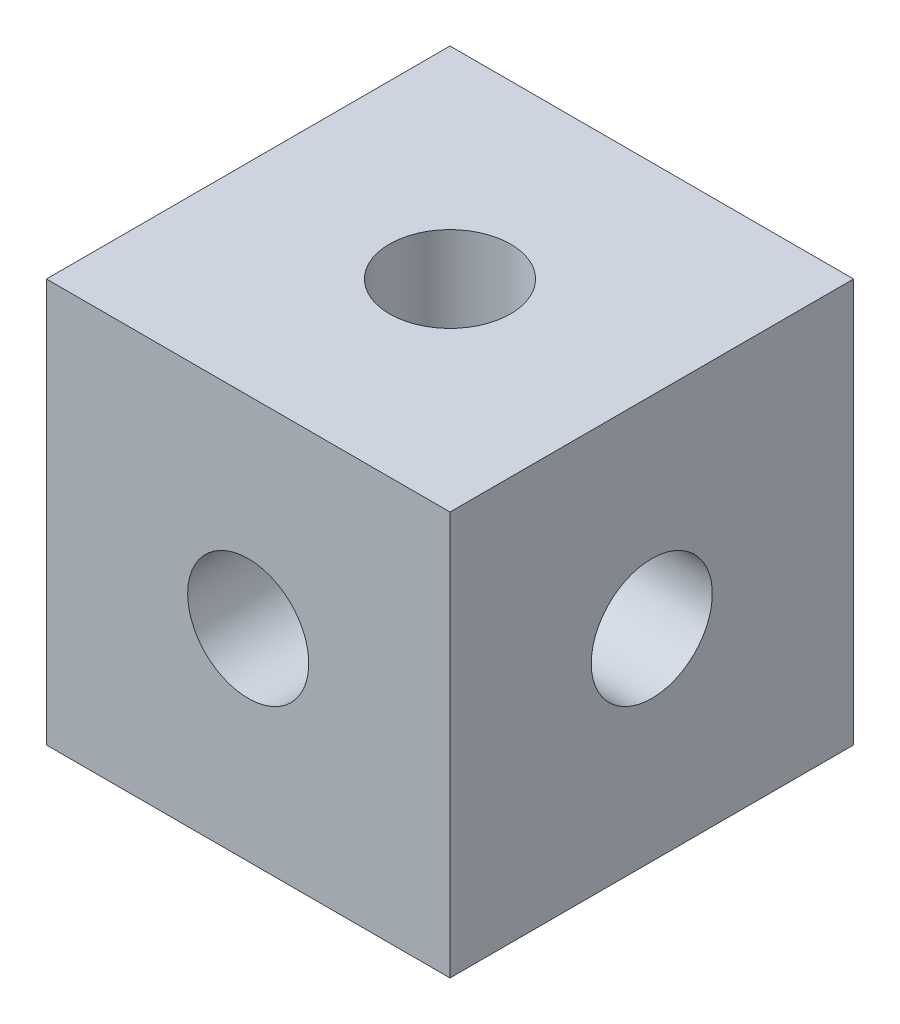
ISO-10303-21;
HEADER;
FILE_DESCRIPTION(('STEP AP214'),'2;1');
FILE_NAME('part.step','',(''),(''),'','','');
FILE_SCHEMA(('AUTOMOTIVE_DESIGN { 1 0 10303 214 1 1 1 1 }'));
ENDSEC;
DATA;
#1=APPLICATION_CONTEXT('core data for automotive mechanical design processes');
#2=APPLICATION_PROTOCOL_DEFINITION('international standard','automotive_design',2000,#1);
#3=PRODUCT_CONTEXT('',#1,'mechanical');
#4=PRODUCT('Part','Part','',(#3));
#5=PRODUCT_RELATED_PRODUCT_CATEGORY('part','',(#4));
#6=PRODUCT_DEFINITION_FORMATION('','',#4);
#7=PRODUCT_DEFINITION_CONTEXT('part definition',#1,'design');
#8=PRODUCT_DEFINITION('design','',#6,#7);
#9=PRODUCT_DEFINITION_SHAPE('','',#8);
#10=(LENGTH_UNIT() NAMED_UNIT(*) SI_UNIT(.MILLI.,.METRE.));
#11=(NAMED_UNIT(*) PLANE_ANGLE_UNIT() SI_UNIT($,.RADIAN.));
#12=(NAMED_UNIT(*) SI_UNIT($,.STERADIAN.) SOLID_ANGLE_UNIT());
#13=UNCERTAINTY_MEASURE_WITH_UNIT(LENGTH_MEASURE(1.E-05),#10,'distance_accuracy_value','');
#14=(GEOMETRIC_REPRESENTATION_CONTEXT(3) GLOBAL_UNCERTAINTY_ASSIGNED_CONTEXT((#13)) GLOBAL_UNIT_ASSIGNED_CONTEXT((#10,
#11,#12)) REPRESENTATION_CONTEXT('',''));
#15=CARTESIAN_POINT('',(0.,0.,0.));
#16=DIRECTION('',(0.,0.,1.));
#17=DIRECTION('',(1.,0.,0.));
#18=AXIS2_PLACEMENT_3D('',#15,#16,#17);
#19=CARTESIAN_POINT('',(5.,10.,-5.));
#20=DIRECTION('',(0.,-1.,0.));
#21=DIRECTION('',(0.,0.,-1.));
#22=AXIS2_PLACEMENT_3D('',#19,#20,#21);
#23=CYLINDRICAL_SURFACE('',#22,1.5);
#24=CARTESIAN_POINT('',(5.,5.,-5.));
#25=DIRECTION('',(-0.707106781186547,-0.707106781186547,0.));
#26=DIRECTION('',(0.707106781186547,-0.707106781186547,0.));
#27=AXIS2_PLACEMENT_3D('',#24,#25,#26);
#28=ELLIPSE('',#27,2.12132034355964,1.5);
#29=CARTESIAN_POINT('',(3.93933982822018,6.06066017177982,-6.06066017177982));
#30=VERTEX_POINT('',#29);
#31=CARTESIAN_POINT('',(3.93933982822018,6.06066017177982,-3.93933982822018));
#32=VERTEX_POINT('',#31);
#33=EDGE_CURVE('E64',#30,#32,#28,.F.);
#34=ORIENTED_EDGE('',*,*,#33,.F.);
#35=CARTESIAN_POINT('',(5.,5.,-5.));
#36=DIRECTION('',(0.,-0.707106781186547,-0.707106781186547));
#37=DIRECTION('',(0.,-0.707106781186547,0.707106781186547));
#38=AXIS2_PLACEMENT_3D('',#35,#36,#37);
#39=ELLIPSE('',#38,2.12132034355964,1.5);
#40=CARTESIAN_POINT('',(6.06066017177982,6.06066017177982,-6.06066017177982));
#41=VERTEX_POINT('',#40);
#42=EDGE_CURVE('E123',#41,#30,#39,.F.);
#43=ORIENTED_EDGE('',*,*,#42,.F.);
#44=CARTESIAN_POINT('',(5.,5.,-5.));
#45=DIRECTION('',(0.707106781186547,-0.707106781186547,0.));
#46=DIRECTION('',(-0.707106781186547,-0.707106781186547,0.));
#47=AXIS2_PLACEMENT_3D('',#44,#45,#46);
#48=ELLIPSE('',#47,2.12132034355964,1.5);
#49=CARTESIAN_POINT('',(6.06066017177982,6.06066017177982,-3.93933982822018));
#50=VERTEX_POINT('',#49);
#51=EDGE_CURVE('E136',#50,#41,#48,.F.);
#52=ORIENTED_EDGE('',*,*,#51,.F.);
#53=CARTESIAN_POINT('',(5.,5.,-5.));
#54=DIRECTION('',(0.,-0.707106781186547,0.707106781186547));
#55=DIRECTION('',(0.,-0.707106781186547,-0.707106781186547));
#56=AXIS2_PLACEMENT_3D('',#53,#54,#55);
#57=ELLIPSE('',#56,2.12132034355964,1.5);
#58=EDGE_CURVE('E112',#32,#50,#57,.F.);
#59=ORIENTED_EDGE('',*,*,#58,.F.);
#60=EDGE_LOOP('',(#34,#43,#52,#59));
#61=FACE_BOUND('',#60,.T.);
#62=CARTESIAN_POINT('',(5.,10.,-5.));
#63=DIRECTION('',(0.,1.,0.));
#64=DIRECTION('',(0.,0.,1.));
#65=AXIS2_PLACEMENT_3D('',#62,#63,#64);
#66=CIRCLE('',#65,1.5);
#67=CARTESIAN_POINT('',(5.,10.,-3.5));
#68=VERTEX_POINT('',#67);
#69=EDGE_CURVE('E154',#68,#68,#66,.T.);
#70=ORIENTED_EDGE('',*,*,#69,.T.);
#71=EDGE_LOOP('',(#70));
#72=FACE_BOUND('',#71,.T.);
#73=ADVANCED_FACE('F41',(#61,#72),#23,.F.);
#74=CARTESIAN_POINT('',(0.,10.,0.));
#75=DIRECTION('',(0.,-1.,0.));
#76=DIRECTION('',(0.,0.,-1.));
#77=AXIS2_PLACEMENT_3D('',#74,#75,#76);
#78=PLANE('',#77);
#79=DIRECTION('',(0.,0.,1.));
#80=VECTOR('',#79,1.);
#81=CARTESIAN_POINT('',(0.,10.,0.));
#82=LINE('',#81,#80);
#83=CARTESIAN_POINT('',(0.,10.,-10.));
#84=VERTEX_POINT('',#83);
#85=CARTESIAN_POINT('',(0.,10.,0.));
#86=VERTEX_POINT('',#85);
#87=EDGE_CURVE('E161',#84,#86,#82,.T.);
#88=ORIENTED_EDGE('',*,*,#87,.T.);
#89=DIRECTION('',(1.,0.,0.));
#90=VECTOR('',#89,1.);
#91=CARTESIAN_POINT('',(0.,10.,0.));
#92=LINE('',#91,#90);
#93=CARTESIAN_POINT('',(10.,10.,0.));
#94=VERTEX_POINT('',#93);
#95=EDGE_CURVE('E163',#86,#94,#92,.T.);
#96=ORIENTED_EDGE('',*,*,#95,.T.);
#97=DIRECTION('',(0.,0.,-1.));
#98=VECTOR('',#97,1.);
#99=CARTESIAN_POINT('',(10.,10.,0.));
#100=LINE('',#99,#98);
#101=CARTESIAN_POINT('',(10.,10.,-10.));
#102=VERTEX_POINT('',#101);
#103=EDGE_CURVE('E170',#94,#102,#100,.T.);
#104=ORIENTED_EDGE('',*,*,#103,.T.);
#105=DIRECTION('',(-1.,0.,0.));
#106=VECTOR('',#105,1.);
#107=CARTESIAN_POINT('',(0.,10.,-10.));
#108=LINE('',#107,#106);
#109=EDGE_CURVE('E166',#102,#84,#108,.T.);
#110=ORIENTED_EDGE('',*,*,#109,.T.);
#111=EDGE_LOOP('',(#88,#96,#104,#110));
#112=FACE_BOUND('',#111,.T.);
#113=ORIENTED_EDGE('',*,*,#69,.F.);
#114=EDGE_LOOP('',(#113));
#115=FACE_BOUND('',#114,.T.);
#116=ADVANCED_FACE('F208',(#112,#115),#78,.F.);
#117=CARTESIAN_POINT('',(0.,0.,0.));
#118=DIRECTION('',(0.,-1.,0.));
#119=DIRECTION('',(0.,0.,-1.));
#120=AXIS2_PLACEMENT_3D('',#117,#118,#119);
#121=PLANE('',#120);
#122=DIRECTION('',(0.,0.,1.));
#123=VECTOR('',#122,1.);
#124=CARTESIAN_POINT('',(0.,0.,0.));
#125=LINE('',#124,#123);
#126=CARTESIAN_POINT('',(0.,0.,-10.));
#127=VERTEX_POINT('',#126);
#128=CARTESIAN_POINT('',(0.,0.,0.));
#129=VERTEX_POINT('',#128);
#130=EDGE_CURVE('E158',#127,#129,#125,.T.);
#131=ORIENTED_EDGE('',*,*,#130,.F.);
#132=DIRECTION('',(-1.,0.,0.));
#133=VECTOR('',#132,1.);
#134=CARTESIAN_POINT('',(0.,0.,-10.));
#135=LINE('',#134,#133);
#136=CARTESIAN_POINT('',(10.,0.,-10.));
#137=VERTEX_POINT('',#136);
#138=EDGE_CURVE('E164',#137,#127,#135,.T.);
#139=ORIENTED_EDGE('',*,*,#138,.F.);
#140=DIRECTION('',(0.,0.,-1.));
#141=VECTOR('',#140,1.);
#142=CARTESIAN_POINT('',(10.,0.,0.));
#143=LINE('',#142,#141);
#144=CARTESIAN_POINT('',(10.,0.,0.));
#145=VERTEX_POINT('',#144);
#146=EDGE_CURVE('E176',#145,#137,#143,.T.);
#147=ORIENTED_EDGE('',*,*,#146,.F.);
#148=DIRECTION('',(1.,0.,0.));
#149=VECTOR('',#148,1.);
#150=CARTESIAN_POINT('',(0.,0.,0.));
#151=LINE('',#150,#149);
#152=EDGE_CURVE('E171',#129,#145,#151,.T.);
#153=ORIENTED_EDGE('',*,*,#152,.F.);
#154=EDGE_LOOP('',(#131,#139,#147,#153));
#155=FACE_BOUND('',#154,.T.);
#156=CARTESIAN_POINT('',(5.,0.,-5.));
#157=DIRECTION('',(0.,1.,0.));
#158=DIRECTION('',(0.,0.,1.));
#159=AXIS2_PLACEMENT_3D('',#156,#157,#158);
#160=CIRCLE('',#159,1.5);
#161=CARTESIAN_POINT('',(5.,0.,-3.5));
#162=VERTEX_POINT('',#161);
#163=EDGE_CURVE('E152',#162,#162,#160,.T.);
#164=ORIENTED_EDGE('',*,*,#163,.T.);
#165=EDGE_LOOP('',(#164));
#166=FACE_BOUND('',#165,.T.);
#167=ADVANCED_FACE('F197',(#155,#166),#121,.T.);
#168=CARTESIAN_POINT('',(0.,10.,0.));
#169=DIRECTION('',(1.,0.,0.));
#170=DIRECTION('',(0.,0.,-1.));
#171=AXIS2_PLACEMENT_3D('',#168,#169,#170);
#172=PLANE('',#171);
#173=CARTESIAN_POINT('',(0.,5.,-5.));
#174=DIRECTION('',(1.,0.,0.));
#175=DIRECTION('',(0.,0.,-1.));
#176=AXIS2_PLACEMENT_3D('',#173,#174,#175);
#177=CIRCLE('',#176,1.5);
#178=CARTESIAN_POINT('',(0.,5.,-6.5));
#179=VERTEX_POINT('',#178);
#180=EDGE_CURVE('E139',#179,#179,#177,.T.);
#181=ORIENTED_EDGE('',*,*,#180,.T.);
#182=EDGE_LOOP('',(#181));
#183=FACE_BOUND('',#182,.T.);
#184=ORIENTED_EDGE('',*,*,#130,.T.);
#185=DIRECTION('',(0.,-1.,0.));
#186=VECTOR('',#185,1.);
#187=CARTESIAN_POINT('',(0.,10.,0.));
#188=LINE('',#187,#186);
#189=EDGE_CURVE('E126',#86,#129,#188,.T.);
#190=ORIENTED_EDGE('',*,*,#189,.F.);
#191=ORIENTED_EDGE('',*,*,#87,.F.);
#192=DIRECTION('',(0.,-1.,0.));
#193=VECTOR('',#192,1.);
#194=CARTESIAN_POINT('',(0.,10.,-10.));
#195=LINE('',#194,#193);
#196=EDGE_CURVE('E172',#84,#127,#195,.T.);
#197=ORIENTED_EDGE('',*,*,#196,.T.);
#198=EDGE_LOOP('',(#184,#190,#191,#197));
#199=FACE_BOUND('',#198,.T.);
#200=ADVANCED_FACE('F43',(#183,#199),#172,.F.);
#201=CARTESIAN_POINT('',(0.,10.,0.));
#202=DIRECTION('',(0.,0.,-1.));
#203=DIRECTION('',(-1.,0.,0.));
#204=AXIS2_PLACEMENT_3D('',#201,#202,#203);
#205=PLANE('',#204);
#206=CARTESIAN_POINT('',(5.,5.,0.));
#207=DIRECTION('',(0.,0.,-1.));
#208=DIRECTION('',(-1.,0.,0.));
#209=AXIS2_PLACEMENT_3D('',#206,#207,#208);
#210=CIRCLE('',#209,1.5);
#211=CARTESIAN_POINT('',(3.5,5.,0.));
#212=VERTEX_POINT('',#211);
#213=EDGE_CURVE('E151',#212,#212,#210,.T.);
#214=ORIENTED_EDGE('',*,*,#213,.T.);
#215=EDGE_LOOP('',(#214));
#216=FACE_BOUND('',#215,.T.);
#217=ORIENTED_EDGE('',*,*,#152,.T.);
#218=DIRECTION('',(0.,-1.,0.));
#219=VECTOR('',#218,1.);
#220=CARTESIAN_POINT('',(10.,10.,0.));
#221=LINE('',#220,#219);
#222=EDGE_CURVE('E184',#94,#145,#221,.T.);
#223=ORIENTED_EDGE('',*,*,#222,.F.);
#224=ORIENTED_EDGE('',*,*,#95,.F.);
#225=ORIENTED_EDGE('',*,*,#189,.T.);
#226=EDGE_LOOP('',(#217,#223,#224,#225));
#227=FACE_BOUND('',#226,.T.);
#228=ADVANCED_FACE('F186',(#216,#227),#205,.F.);
#229=CARTESIAN_POINT('',(10.,10.,0.));
#230=DIRECTION('',(-1.,0.,0.));
#231=DIRECTION('',(0.,0.,1.));
#232=AXIS2_PLACEMENT_3D('',#229,#230,#231);
#233=PLANE('',#232);
#234=CARTESIAN_POINT('',(10.,5.,-5.));
#235=DIRECTION('',(-1.,0.,0.));
#236=DIRECTION('',(0.,0.,1.));
#237=AXIS2_PLACEMENT_3D('',#234,#235,#236);
#238=CIRCLE('',#237,1.5);
#239=CARTESIAN_POINT('',(10.,5.,-3.5));
#240=VERTEX_POINT('',#239);
#241=EDGE_CURVE('E118',#240,#240,#238,.T.);
#242=ORIENTED_EDGE('',*,*,#241,.T.);
#243=EDGE_LOOP('',(#242));
#244=FACE_BOUND('',#243,.T.);
#245=ORIENTED_EDGE('',*,*,#146,.T.);
#246=DIRECTION('',(0.,-1.,0.));
#247=VECTOR('',#246,1.);
#248=CARTESIAN_POINT('',(10.,10.,-10.));
#249=LINE('',#248,#247);
#250=EDGE_CURVE('E182',#102,#137,#249,.T.);
#251=ORIENTED_EDGE('',*,*,#250,.F.);
#252=ORIENTED_EDGE('',*,*,#103,.F.);
#253=ORIENTED_EDGE('',*,*,#222,.T.);
#254=EDGE_LOOP('',(#245,#251,#252,#253));
#255=FACE_BOUND('',#254,.T.);
#256=ADVANCED_FACE('F205',(#244,#255),#233,.F.);
#257=CARTESIAN_POINT('',(0.,10.,-10.));
#258=DIRECTION('',(0.,0.,1.));
#259=DIRECTION('',(1.,0.,0.));
#260=AXIS2_PLACEMENT_3D('',#257,#258,#259);
#261=PLANE('',#260);
#262=CARTESIAN_POINT('',(5.,5.,-10.));
#263=DIRECTION('',(0.,0.,1.));
#264=DIRECTION('',(1.,0.,0.));
#265=AXIS2_PLACEMENT_3D('',#262,#263,#264);
#266=CIRCLE('',#265,1.5);
#267=CARTESIAN_POINT('',(6.5,5.,-10.));
#268=VERTEX_POINT('',#267);
#269=EDGE_CURVE('E146',#268,#268,#266,.T.);
#270=ORIENTED_EDGE('',*,*,#269,.T.);
#271=EDGE_LOOP('',(#270));
#272=FACE_BOUND('',#271,.T.);
#273=ORIENTED_EDGE('',*,*,#138,.T.);
#274=ORIENTED_EDGE('',*,*,#196,.F.);
#275=ORIENTED_EDGE('',*,*,#109,.F.);
#276=ORIENTED_EDGE('',*,*,#250,.T.);
#277=EDGE_LOOP('',(#273,#274,#275,#276));
#278=FACE_BOUND('',#277,.T.);
#279=ADVANCED_FACE('F206',(#272,#278),#261,.F.);
#280=CARTESIAN_POINT('',(5.,5.,-5.));
#281=DIRECTION('',(-0.707106781186547,-0.707106781186547,0.));
#282=DIRECTION('',(0.707106781186547,-0.707106781186547,0.));
#283=AXIS2_PLACEMENT_3D('',#280,#281,#282);
#284=ELLIPSE('',#283,2.12132034355964,1.5);
#285=CARTESIAN_POINT('',(6.06066017177982,3.93933982822018,-6.06066017177982));
#286=VERTEX_POINT('',#285);
#287=CARTESIAN_POINT('',(6.06066017177982,3.93933982822018,-3.93933982822018));
#288=VERTEX_POINT('',#287);
#289=EDGE_CURVE('E57',#286,#288,#284,.T.);
#290=ORIENTED_EDGE('',*,*,#289,.F.);
#291=CARTESIAN_POINT('',(5.,5.,-5.));
#292=DIRECTION('',(0.,-0.707106781186547,0.707106781186547));
#293=DIRECTION('',(0.,-0.707106781186547,-0.707106781186547));
#294=AXIS2_PLACEMENT_3D('',#291,#292,#293);
#295=ELLIPSE('',#294,2.12132034355964,1.5);
#296=CARTESIAN_POINT('',(3.93933982822018,3.93933982822018,-6.06066017177982));
#297=VERTEX_POINT('',#296);
#298=EDGE_CURVE('E116',#297,#286,#295,.T.);
#299=ORIENTED_EDGE('',*,*,#298,.F.);
#300=CARTESIAN_POINT('',(5.,5.,-5.));
#301=DIRECTION('',(0.707106781186547,-0.707106781186547,0.));
#302=DIRECTION('',(-0.707106781186547,-0.707106781186547,0.));
#303=AXIS2_PLACEMENT_3D('',#300,#301,#302);
#304=ELLIPSE('',#303,2.12132034355964,1.5);
#305=CARTESIAN_POINT('',(3.93933982822018,3.93933982822018,-3.93933982822018));
#306=VERTEX_POINT('',#305);
#307=EDGE_CURVE('E104',#306,#297,#304,.T.);
#308=ORIENTED_EDGE('',*,*,#307,.F.);
#309=CARTESIAN_POINT('',(5.,5.,-5.));
#310=DIRECTION('',(0.,-0.707106781186547,-0.707106781186547));
#311=DIRECTION('',(0.,-0.707106781186547,0.707106781186547));
#312=AXIS2_PLACEMENT_3D('',#309,#310,#311);
#313=ELLIPSE('',#312,2.12132034355964,1.5);
#314=EDGE_CURVE('E120',#288,#306,#313,.T.);
#315=ORIENTED_EDGE('',*,*,#314,.F.);
#316=EDGE_LOOP('',(#290,#299,#308,#315));
#317=FACE_BOUND('',#316,.T.);
#318=ORIENTED_EDGE('',*,*,#163,.F.);
#319=EDGE_LOOP('',(#318));
#320=FACE_BOUND('',#319,.T.);
#321=ADVANCED_FACE('F113',(#317,#320),#23,.F.);
#322=CARTESIAN_POINT('',(5.,5.,-10.));
#323=DIRECTION('',(0.,0.,1.));
#324=DIRECTION('',(1.,0.,0.));
#325=AXIS2_PLACEMENT_3D('',#322,#323,#324);
#326=CYLINDRICAL_SURFACE('',#325,1.5);
#327=ORIENTED_EDGE('',*,*,#42,.T.);
#328=CARTESIAN_POINT('',(5.,5.,-5.));
#329=DIRECTION('',(-0.707106781186547,0.,0.707106781186547));
#330=DIRECTION('',(0.707106781186547,0.,0.707106781186547));
#331=AXIS2_PLACEMENT_3D('',#328,#329,#330);
#332=ELLIPSE('',#331,2.12132034355964,1.5);
#333=EDGE_CURVE('E142',#30,#297,#332,.T.);
#334=ORIENTED_EDGE('',*,*,#333,.T.);
#335=ORIENTED_EDGE('',*,*,#298,.T.);
#336=CARTESIAN_POINT('',(5.,5.,-5.));
#337=DIRECTION('',(0.707106781186547,0.,0.707106781186547));
#338=DIRECTION('',(-0.707106781186547,0.,0.707106781186547));
#339=AXIS2_PLACEMENT_3D('',#336,#337,#338);
#340=ELLIPSE('',#339,2.12132034355964,1.5);
#341=EDGE_CURVE('E137',#286,#41,#340,.T.);
#342=ORIENTED_EDGE('',*,*,#341,.T.);
#343=EDGE_LOOP('',(#327,#334,#335,#342));
#344=FACE_BOUND('',#343,.T.);
#345=ORIENTED_EDGE('',*,*,#269,.F.);
#346=EDGE_LOOP('',(#345));
#347=FACE_BOUND('',#346,.T.);
#348=ADVANCED_FACE('F222',(#344,#347),#326,.F.);
#349=ORIENTED_EDGE('',*,*,#58,.T.);
#350=CARTESIAN_POINT('',(5.,5.,-5.));
#351=DIRECTION('',(-0.707106781186547,0.,0.707106781186547));
#352=DIRECTION('',(0.707106781186547,0.,0.707106781186547));
#353=AXIS2_PLACEMENT_3D('',#350,#351,#352);
#354=ELLIPSE('',#353,2.12132034355964,1.5);
#355=EDGE_CURVE('E11',#50,#288,#354,.F.);
#356=ORIENTED_EDGE('',*,*,#355,.T.);
#357=ORIENTED_EDGE('',*,*,#314,.T.);
#358=CARTESIAN_POINT('',(5.,5.,-5.));
#359=DIRECTION('',(0.707106781186547,0.,0.707106781186547));
#360=DIRECTION('',(-0.707106781186547,0.,0.707106781186547));
#361=AXIS2_PLACEMENT_3D('',#358,#359,#360);
#362=ELLIPSE('',#361,2.12132034355964,1.5);
#363=EDGE_CURVE('E47',#306,#32,#362,.F.);
#364=ORIENTED_EDGE('',*,*,#363,.T.);
#365=EDGE_LOOP('',(#349,#356,#357,#364));
#366=FACE_BOUND('',#365,.T.);
#367=ORIENTED_EDGE('',*,*,#213,.F.);
#368=EDGE_LOOP('',(#367));
#369=FACE_BOUND('',#368,.T.);
#370=ADVANCED_FACE('F125',(#366,#369),#326,.F.);
#371=CARTESIAN_POINT('',(10.,5.,-5.));
#372=DIRECTION('',(-1.,0.,0.));
#373=DIRECTION('',(0.,0.,1.));
#374=AXIS2_PLACEMENT_3D('',#371,#372,#373);
#375=CYLINDRICAL_SURFACE('',#374,1.5);
#376=ORIENTED_EDGE('',*,*,#33,.T.);
#377=ORIENTED_EDGE('',*,*,#363,.F.);
#378=ORIENTED_EDGE('',*,*,#307,.T.);
#379=ORIENTED_EDGE('',*,*,#333,.F.);
#380=EDGE_LOOP('',(#376,#377,#378,#379));
#381=FACE_BOUND('',#380,.T.);
#382=ORIENTED_EDGE('',*,*,#180,.F.);
#383=EDGE_LOOP('',(#382));
#384=FACE_BOUND('',#383,.T.);
#385=ADVANCED_FACE('F103',(#381,#384),#375,.F.);
#386=ORIENTED_EDGE('',*,*,#241,.F.);
#387=EDGE_LOOP('',(#386));
#388=FACE_BOUND('',#387,.T.);
#389=ORIENTED_EDGE('',*,*,#289,.T.);
#390=ORIENTED_EDGE('',*,*,#355,.F.);
#391=ORIENTED_EDGE('',*,*,#51,.T.);
#392=ORIENTED_EDGE('',*,*,#341,.F.);
#393=EDGE_LOOP('',(#389,#390,#391,#392));
#394=FACE_BOUND('',#393,.T.);
#395=ADVANCED_FACE('F243',(#388,#394),#375,.F.);
#396=CLOSED_SHELL('',(#73,#116,#167,#200,#228,#256,#279,#321,#348,#370,#385,#395));
#397=MANIFOLD_SOLID_BREP('B2',#396);
#398=ADVANCED_BREP_SHAPE_REPRESENTATION('',(#18,#397),#14);
#399=SHAPE_DEFINITION_REPRESENTATION(#9,#398);
ENDSEC;
END-ISO-10303-21;
